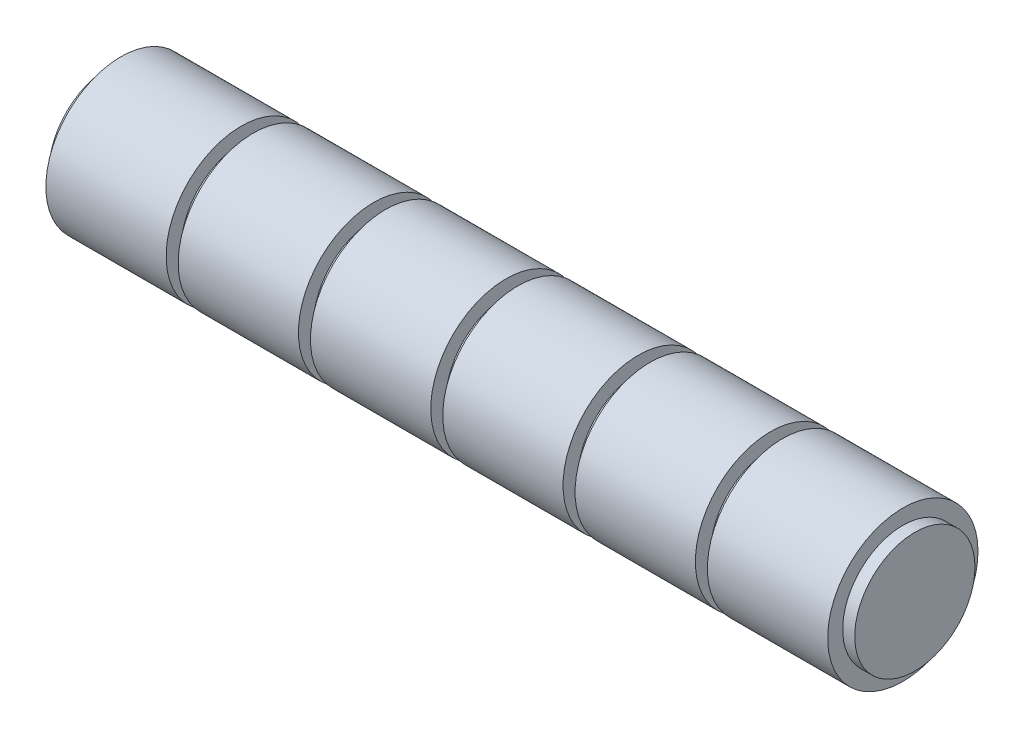
ISO-10303-21;
HEADER;
FILE_DESCRIPTION(('STEP AP214'),'2;1');
FILE_NAME('part.step','',(''),(''),'','','');
FILE_SCHEMA(('AUTOMOTIVE_DESIGN { 1 0 10303 214 1 1 1 1 }'));
ENDSEC;
DATA;
#1=APPLICATION_CONTEXT('core data for automotive mechanical design processes');
#2=APPLICATION_PROTOCOL_DEFINITION('international standard','automotive_design',2000,#1);
#3=PRODUCT_CONTEXT('',#1,'mechanical');
#4=PRODUCT('Part','Part','',(#3));
#5=PRODUCT_RELATED_PRODUCT_CATEGORY('part','',(#4));
#6=PRODUCT_DEFINITION_FORMATION('','',#4);
#7=PRODUCT_DEFINITION_CONTEXT('part definition',#1,'design');
#8=PRODUCT_DEFINITION('design','',#6,#7);
#9=PRODUCT_DEFINITION_SHAPE('','',#8);
#10=(LENGTH_UNIT() NAMED_UNIT(*) SI_UNIT(.MILLI.,.METRE.));
#11=(NAMED_UNIT(*) PLANE_ANGLE_UNIT() SI_UNIT($,.RADIAN.));
#12=(NAMED_UNIT(*) SI_UNIT($,.STERADIAN.) SOLID_ANGLE_UNIT());
#13=UNCERTAINTY_MEASURE_WITH_UNIT(LENGTH_MEASURE(1.E-05),#10,'distance_accuracy_value','');
#14=(GEOMETRIC_REPRESENTATION_CONTEXT(3) GLOBAL_UNCERTAINTY_ASSIGNED_CONTEXT((#13)) GLOBAL_UNIT_ASSIGNED_CONTEXT((#10,
#11,#12)) REPRESENTATION_CONTEXT('',''));
#15=CARTESIAN_POINT('',(0.,0.,0.));
#16=DIRECTION('',(0.,0.,1.));
#17=DIRECTION('',(1.,0.,0.));
#18=AXIS2_PLACEMENT_3D('',#15,#16,#17);
#19=CARTESIAN_POINT('',(20.,0.,0.));
#20=DIRECTION('',(-1.,0.,0.));
#21=DIRECTION('',(0.,0.,1.));
#22=AXIS2_PLACEMENT_3D('',#19,#20,#21);
#23=CYLINDRICAL_SURFACE('',#22,12.5);
#24=CARTESIAN_POINT('',(20.,0.,0.));
#25=DIRECTION('',(1.,0.,0.));
#26=DIRECTION('',(0.,0.,-1.));
#27=AXIS2_PLACEMENT_3D('',#24,#25,#26);
#28=CIRCLE('',#27,12.5);
#29=CARTESIAN_POINT('',(20.,0.,-12.5));
#30=VERTEX_POINT('',#29);
#31=EDGE_CURVE('E59',#30,#30,#28,.T.);
#32=ORIENTED_EDGE('',*,*,#31,.F.);
#33=EDGE_LOOP('',(#32));
#34=FACE_BOUND('',#33,.T.);
#35=CARTESIAN_POINT('',(0.,0.,0.));
#36=DIRECTION('',(1.,0.,0.));
#37=DIRECTION('',(0.,0.,-1.));
#38=AXIS2_PLACEMENT_3D('',#35,#36,#37);
#39=CIRCLE('',#38,12.5);
#40=CARTESIAN_POINT('',(0.,0.,-12.5));
#41=VERTEX_POINT('',#40);
#42=EDGE_CURVE('E48',#41,#41,#39,.T.);
#43=ORIENTED_EDGE('',*,*,#42,.T.);
#44=EDGE_LOOP('',(#43));
#45=FACE_BOUND('',#44,.T.);
#46=ADVANCED_FACE('F45',(#34,#45),#23,.T.);
#47=CARTESIAN_POINT('',(20.,0.,0.));
#48=DIRECTION('',(1.,0.,0.));
#49=DIRECTION('',(0.,0.,-1.));
#50=AXIS2_PLACEMENT_3D('',#47,#48,#49);
#51=PLANE('',#50);
#52=CARTESIAN_POINT('',(20.,0.,0.));
#53=DIRECTION('',(1.,0.,0.));
#54=DIRECTION('',(0.,0.,-1.));
#55=AXIS2_PLACEMENT_3D('',#52,#53,#54);
#56=CIRCLE('',#55,10.);
#57=CARTESIAN_POINT('',(20.,0.,-10.));
#58=VERTEX_POINT('',#57);
#59=EDGE_CURVE('E53',#58,#58,#56,.T.);
#60=ORIENTED_EDGE('',*,*,#59,.F.);
#61=EDGE_LOOP('',(#60));
#62=FACE_BOUND('',#61,.T.);
#63=ORIENTED_EDGE('',*,*,#31,.T.);
#64=EDGE_LOOP('',(#63));
#65=FACE_BOUND('',#64,.T.);
#66=ADVANCED_FACE('F97',(#62,#65),#51,.T.);
#67=CARTESIAN_POINT('',(0.,0.,0.));
#68=DIRECTION('',(1.,0.,0.));
#69=DIRECTION('',(0.,0.,-1.));
#70=AXIS2_PLACEMENT_3D('',#67,#68,#69);
#71=PLANE('',#70);
#72=CARTESIAN_POINT('',(0.,0.,0.));
#73=DIRECTION('',(1.,0.,0.));
#74=DIRECTION('',(0.,0.,-1.));
#75=AXIS2_PLACEMENT_3D('',#72,#73,#74);
#76=CIRCLE('',#75,10.);
#77=CARTESIAN_POINT('',(0.,0.,-10.));
#78=VERTEX_POINT('',#77);
#79=EDGE_CURVE('E65',#78,#78,#76,.T.);
#80=ORIENTED_EDGE('',*,*,#79,.T.);
#81=EDGE_LOOP('',(#80));
#82=FACE_BOUND('',#81,.T.);
#83=ORIENTED_EDGE('',*,*,#42,.F.);
#84=EDGE_LOOP('',(#83));
#85=FACE_BOUND('',#84,.T.);
#86=ADVANCED_FACE('F94',(#82,#85),#71,.F.);
#87=CARTESIAN_POINT('',(22.,0.,0.));
#88=DIRECTION('',(-1.,0.,0.));
#89=DIRECTION('',(0.,0.,1.));
#90=AXIS2_PLACEMENT_3D('',#87,#88,#89);
#91=CYLINDRICAL_SURFACE('',#90,10.);
#92=CARTESIAN_POINT('',(22.,0.,0.));
#93=DIRECTION('',(1.,0.,0.));
#94=DIRECTION('',(0.,0.,-1.));
#95=AXIS2_PLACEMENT_3D('',#92,#93,#94);
#96=CIRCLE('',#95,10.);
#97=CARTESIAN_POINT('',(22.,0.,-10.));
#98=VERTEX_POINT('',#97);
#99=EDGE_CURVE('E79',#98,#98,#96,.T.);
#100=ORIENTED_EDGE('',*,*,#99,.F.);
#101=EDGE_LOOP('',(#100));
#102=FACE_BOUND('',#101,.T.);
#103=ORIENTED_EDGE('',*,*,#59,.T.);
#104=EDGE_LOOP('',(#103));
#105=FACE_BOUND('',#104,.T.);
#106=ADVANCED_FACE('F96',(#102,#105),#91,.T.);
#107=CARTESIAN_POINT('',(42.,0.,0.));
#108=DIRECTION('',(-1.,0.,0.));
#109=DIRECTION('',(0.,0.,1.));
#110=AXIS2_PLACEMENT_3D('',#107,#108,#109);
#111=CYLINDRICAL_SURFACE('',#110,12.5);
#112=CARTESIAN_POINT('',(42.,0.,0.));
#113=DIRECTION('',(1.,0.,0.));
#114=DIRECTION('',(0.,0.,-1.));
#115=AXIS2_PLACEMENT_3D('',#112,#113,#114);
#116=CIRCLE('',#115,12.5);
#117=CARTESIAN_POINT('',(42.,0.,-12.5));
#118=VERTEX_POINT('',#117);
#119=EDGE_CURVE('E75',#118,#118,#116,.T.);
#120=ORIENTED_EDGE('',*,*,#119,.F.);
#121=EDGE_LOOP('',(#120));
#122=FACE_BOUND('',#121,.T.);
#123=CARTESIAN_POINT('',(22.,0.,0.));
#124=DIRECTION('',(1.,0.,0.));
#125=DIRECTION('',(0.,0.,-1.));
#126=AXIS2_PLACEMENT_3D('',#123,#124,#125);
#127=CIRCLE('',#126,12.5);
#128=CARTESIAN_POINT('',(22.,0.,-12.5));
#129=VERTEX_POINT('',#128);
#130=EDGE_CURVE('E69',#129,#129,#127,.T.);
#131=ORIENTED_EDGE('',*,*,#130,.T.);
#132=EDGE_LOOP('',(#131));
#133=FACE_BOUND('',#132,.T.);
#134=ADVANCED_FACE('F103',(#122,#133),#111,.T.);
#135=CARTESIAN_POINT('',(42.,0.,0.));
#136=DIRECTION('',(1.,0.,0.));
#137=DIRECTION('',(0.,0.,-1.));
#138=AXIS2_PLACEMENT_3D('',#135,#136,#137);
#139=PLANE('',#138);
#140=CARTESIAN_POINT('',(42.,0.,0.));
#141=DIRECTION('',(1.,0.,0.));
#142=DIRECTION('',(0.,0.,-1.));
#143=AXIS2_PLACEMENT_3D('',#140,#141,#142);
#144=CIRCLE('',#143,10.);
#145=CARTESIAN_POINT('',(42.,0.,-10.));
#146=VERTEX_POINT('',#145);
#147=EDGE_CURVE('E10',#146,#146,#144,.T.);
#148=ORIENTED_EDGE('',*,*,#147,.F.);
#149=EDGE_LOOP('',(#148));
#150=FACE_BOUND('',#149,.T.);
#151=ORIENTED_EDGE('',*,*,#119,.T.);
#152=EDGE_LOOP('',(#151));
#153=FACE_BOUND('',#152,.T.);
#154=ADVANCED_FACE('F136',(#150,#153),#139,.T.);
#155=CARTESIAN_POINT('',(22.,0.,0.));
#156=DIRECTION('',(1.,0.,0.));
#157=DIRECTION('',(0.,0.,-1.));
#158=AXIS2_PLACEMENT_3D('',#155,#156,#157);
#159=PLANE('',#158);
#160=ORIENTED_EDGE('',*,*,#99,.T.);
#161=EDGE_LOOP('',(#160));
#162=FACE_BOUND('',#161,.T.);
#163=ORIENTED_EDGE('',*,*,#130,.F.);
#164=EDGE_LOOP('',(#163));
#165=FACE_BOUND('',#164,.T.);
#166=ADVANCED_FACE('F145',(#162,#165),#159,.F.);
#167=CARTESIAN_POINT('',(0.,0.,0.));
#168=DIRECTION('',(-1.,0.,0.));
#169=DIRECTION('',(0.,0.,1.));
#170=AXIS2_PLACEMENT_3D('',#167,#168,#169);
#171=CYLINDRICAL_SURFACE('',#170,10.);
#172=ORIENTED_EDGE('',*,*,#79,.F.);
#173=EDGE_LOOP('',(#172));
#174=FACE_BOUND('',#173,.T.);
#175=CARTESIAN_POINT('',(-2.,0.,0.));
#176=DIRECTION('',(1.,0.,0.));
#177=DIRECTION('',(0.,0.,-1.));
#178=AXIS2_PLACEMENT_3D('',#175,#176,#177);
#179=CIRCLE('',#178,10.);
#180=CARTESIAN_POINT('',(-2.,0.,-10.));
#181=VERTEX_POINT('',#180);
#182=EDGE_CURVE('E70',#181,#181,#179,.T.);
#183=ORIENTED_EDGE('',*,*,#182,.T.);
#184=EDGE_LOOP('',(#183));
#185=FACE_BOUND('',#184,.T.);
#186=ADVANCED_FACE('F155',(#174,#185),#171,.T.);
#187=CARTESIAN_POINT('',(44.,0.,0.));
#188=DIRECTION('',(-1.,0.,0.));
#189=DIRECTION('',(0.,0.,1.));
#190=AXIS2_PLACEMENT_3D('',#187,#188,#189);
#191=CYLINDRICAL_SURFACE('',#190,10.);
#192=CARTESIAN_POINT('',(44.,0.,0.));
#193=DIRECTION('',(1.,0.,0.));
#194=DIRECTION('',(0.,0.,-1.));
#195=AXIS2_PLACEMENT_3D('',#192,#193,#194);
#196=CIRCLE('',#195,10.);
#197=CARTESIAN_POINT('',(44.,0.,-10.));
#198=VERTEX_POINT('',#197);
#199=EDGE_CURVE('E63',#198,#198,#196,.T.);
#200=ORIENTED_EDGE('',*,*,#199,.F.);
#201=EDGE_LOOP('',(#200));
#202=FACE_BOUND('',#201,.T.);
#203=ORIENTED_EDGE('',*,*,#147,.T.);
#204=EDGE_LOOP('',(#203));
#205=FACE_BOUND('',#204,.T.);
#206=ADVANCED_FACE('F166',(#202,#205),#191,.T.);
#207=CARTESIAN_POINT('',(44.,0.,0.));
#208=DIRECTION('',(1.,0.,0.));
#209=DIRECTION('',(0.,0.,-1.));
#210=AXIS2_PLACEMENT_3D('',#207,#208,#209);
#211=PLANE('',#210);
#212=ORIENTED_EDGE('',*,*,#199,.T.);
#213=EDGE_LOOP('',(#212));
#214=FACE_BOUND('',#213,.T.);
#215=ADVANCED_FACE('F176',(#214),#211,.T.);
#216=CARTESIAN_POINT('',(-2.,0.,0.));
#217=DIRECTION('',(-1.,0.,0.));
#218=DIRECTION('',(0.,0.,1.));
#219=AXIS2_PLACEMENT_3D('',#216,#217,#218);
#220=CYLINDRICAL_SURFACE('',#219,12.5);
#221=CARTESIAN_POINT('',(-2.,0.,0.));
#222=DIRECTION('',(1.,0.,0.));
#223=DIRECTION('',(0.,0.,-1.));
#224=AXIS2_PLACEMENT_3D('',#221,#222,#223);
#225=CIRCLE('',#224,12.5);
#226=CARTESIAN_POINT('',(-2.,0.,-12.5));
#227=VERTEX_POINT('',#226);
#228=EDGE_CURVE('E74',#227,#227,#225,.T.);
#229=ORIENTED_EDGE('',*,*,#228,.F.);
#230=EDGE_LOOP('',(#229));
#231=FACE_BOUND('',#230,.T.);
#232=CARTESIAN_POINT('',(-22.,0.,0.));
#233=DIRECTION('',(1.,0.,0.));
#234=DIRECTION('',(0.,0.,-1.));
#235=AXIS2_PLACEMENT_3D('',#232,#233,#234);
#236=CIRCLE('',#235,12.5);
#237=CARTESIAN_POINT('',(-22.,0.,-12.5));
#238=VERTEX_POINT('',#237);
#239=EDGE_CURVE('E555',#238,#238,#236,.T.);
#240=ORIENTED_EDGE('',*,*,#239,.T.);
#241=EDGE_LOOP('',(#240));
#242=FACE_BOUND('',#241,.T.);
#243=ADVANCED_FACE('F186',(#231,#242),#220,.T.);
#244=CARTESIAN_POINT('',(-2.,0.,0.));
#245=DIRECTION('',(1.,0.,0.));
#246=DIRECTION('',(0.,0.,-1.));
#247=AXIS2_PLACEMENT_3D('',#244,#245,#246);
#248=PLANE('',#247);
#249=ORIENTED_EDGE('',*,*,#182,.F.);
#250=EDGE_LOOP('',(#249));
#251=FACE_BOUND('',#250,.T.);
#252=ORIENTED_EDGE('',*,*,#228,.T.);
#253=EDGE_LOOP('',(#252));
#254=FACE_BOUND('',#253,.T.);
#255=ADVANCED_FACE('F197',(#251,#254),#248,.T.);
#256=CARTESIAN_POINT('',(-22.,0.,0.));
#257=DIRECTION('',(1.,0.,0.));
#258=DIRECTION('',(0.,0.,-1.));
#259=AXIS2_PLACEMENT_3D('',#256,#257,#258);
#260=PLANE('',#259);
#261=CARTESIAN_POINT('',(-22.,0.,0.));
#262=DIRECTION('',(1.,0.,0.));
#263=DIRECTION('',(0.,0.,-1.));
#264=AXIS2_PLACEMENT_3D('',#261,#262,#263);
#265=CIRCLE('',#264,10.);
#266=CARTESIAN_POINT('',(-22.,0.,-10.));
#267=VERTEX_POINT('',#266);
#268=EDGE_CURVE('E551',#267,#267,#265,.T.);
#269=ORIENTED_EDGE('',*,*,#268,.T.);
#270=EDGE_LOOP('',(#269));
#271=FACE_BOUND('',#270,.T.);
#272=ORIENTED_EDGE('',*,*,#239,.F.);
#273=EDGE_LOOP('',(#272));
#274=FACE_BOUND('',#273,.T.);
#275=ADVANCED_FACE('F208',(#271,#274),#260,.F.);
#276=CARTESIAN_POINT('',(-22.,0.,0.));
#277=DIRECTION('',(-1.,0.,0.));
#278=DIRECTION('',(0.,0.,1.));
#279=AXIS2_PLACEMENT_3D('',#276,#277,#278);
#280=CYLINDRICAL_SURFACE('',#279,10.);
#281=ORIENTED_EDGE('',*,*,#268,.F.);
#282=EDGE_LOOP('',(#281));
#283=FACE_BOUND('',#282,.T.);
#284=CARTESIAN_POINT('',(-24.,0.,0.));
#285=DIRECTION('',(1.,0.,0.));
#286=DIRECTION('',(0.,0.,-1.));
#287=AXIS2_PLACEMENT_3D('',#284,#285,#286);
#288=CIRCLE('',#287,10.);
#289=CARTESIAN_POINT('',(-24.,0.,-10.));
#290=VERTEX_POINT('',#289);
#291=EDGE_CURVE('E547',#290,#290,#288,.T.);
#292=ORIENTED_EDGE('',*,*,#291,.T.);
#293=EDGE_LOOP('',(#292));
#294=FACE_BOUND('',#293,.T.);
#295=ADVANCED_FACE('F219',(#283,#294),#280,.T.);
#296=CARTESIAN_POINT('',(-24.,0.,0.));
#297=DIRECTION('',(-1.,0.,0.));
#298=DIRECTION('',(0.,0.,1.));
#299=AXIS2_PLACEMENT_3D('',#296,#297,#298);
#300=CYLINDRICAL_SURFACE('',#299,12.5);
#301=CARTESIAN_POINT('',(-24.,0.,0.));
#302=DIRECTION('',(1.,0.,0.));
#303=DIRECTION('',(0.,0.,-1.));
#304=AXIS2_PLACEMENT_3D('',#301,#302,#303);
#305=CIRCLE('',#304,12.5);
#306=CARTESIAN_POINT('',(-24.,0.,-12.5));
#307=VERTEX_POINT('',#306);
#308=EDGE_CURVE('E543',#307,#307,#305,.T.);
#309=ORIENTED_EDGE('',*,*,#308,.F.);
#310=EDGE_LOOP('',(#309));
#311=FACE_BOUND('',#310,.T.);
#312=CARTESIAN_POINT('',(-44.,0.,0.));
#313=DIRECTION('',(1.,0.,0.));
#314=DIRECTION('',(0.,0.,-1.));
#315=AXIS2_PLACEMENT_3D('',#312,#313,#314);
#316=CIRCLE('',#315,12.5);
#317=CARTESIAN_POINT('',(-44.,0.,-12.5));
#318=VERTEX_POINT('',#317);
#319=EDGE_CURVE('E539',#318,#318,#316,.T.);
#320=ORIENTED_EDGE('',*,*,#319,.T.);
#321=EDGE_LOOP('',(#320));
#322=FACE_BOUND('',#321,.T.);
#323=ADVANCED_FACE('F230',(#311,#322),#300,.T.);
#324=CARTESIAN_POINT('',(-24.,0.,0.));
#325=DIRECTION('',(1.,0.,0.));
#326=DIRECTION('',(0.,0.,-1.));
#327=AXIS2_PLACEMENT_3D('',#324,#325,#326);
#328=PLANE('',#327);
#329=ORIENTED_EDGE('',*,*,#291,.F.);
#330=EDGE_LOOP('',(#329));
#331=FACE_BOUND('',#330,.T.);
#332=ORIENTED_EDGE('',*,*,#308,.T.);
#333=EDGE_LOOP('',(#332));
#334=FACE_BOUND('',#333,.T.);
#335=ADVANCED_FACE('F241',(#331,#334),#328,.T.);
#336=CARTESIAN_POINT('',(-44.,0.,0.));
#337=DIRECTION('',(1.,0.,0.));
#338=DIRECTION('',(0.,0.,-1.));
#339=AXIS2_PLACEMENT_3D('',#336,#337,#338);
#340=PLANE('',#339);
#341=CARTESIAN_POINT('',(-44.,0.,0.));
#342=DIRECTION('',(1.,0.,0.));
#343=DIRECTION('',(0.,0.,-1.));
#344=AXIS2_PLACEMENT_3D('',#341,#342,#343);
#345=CIRCLE('',#344,10.);
#346=CARTESIAN_POINT('',(-44.,0.,-10.));
#347=VERTEX_POINT('',#346);
#348=EDGE_CURVE('E535',#347,#347,#345,.T.);
#349=ORIENTED_EDGE('',*,*,#348,.T.);
#350=EDGE_LOOP('',(#349));
#351=FACE_BOUND('',#350,.T.);
#352=ORIENTED_EDGE('',*,*,#319,.F.);
#353=EDGE_LOOP('',(#352));
#354=FACE_BOUND('',#353,.T.);
#355=ADVANCED_FACE('F252',(#351,#354),#340,.F.);
#356=CARTESIAN_POINT('',(-44.,0.,0.));
#357=DIRECTION('',(-1.,0.,0.));
#358=DIRECTION('',(0.,0.,1.));
#359=AXIS2_PLACEMENT_3D('',#356,#357,#358);
#360=CYLINDRICAL_SURFACE('',#359,10.);
#361=ORIENTED_EDGE('',*,*,#348,.F.);
#362=EDGE_LOOP('',(#361));
#363=FACE_BOUND('',#362,.T.);
#364=CARTESIAN_POINT('',(-46.,0.,0.));
#365=DIRECTION('',(1.,0.,0.));
#366=DIRECTION('',(0.,0.,-1.));
#367=AXIS2_PLACEMENT_3D('',#364,#365,#366);
#368=CIRCLE('',#367,10.);
#369=CARTESIAN_POINT('',(-46.,0.,-10.));
#370=VERTEX_POINT('',#369);
#371=EDGE_CURVE('E531',#370,#370,#368,.T.);
#372=ORIENTED_EDGE('',*,*,#371,.T.);
#373=EDGE_LOOP('',(#372));
#374=FACE_BOUND('',#373,.T.);
#375=ADVANCED_FACE('F262',(#363,#374),#360,.T.);
#376=CARTESIAN_POINT('',(-46.,0.,0.));
#377=DIRECTION('',(-1.,0.,0.));
#378=DIRECTION('',(0.,0.,1.));
#379=AXIS2_PLACEMENT_3D('',#376,#377,#378);
#380=CYLINDRICAL_SURFACE('',#379,12.5);
#381=CARTESIAN_POINT('',(-46.,0.,0.));
#382=DIRECTION('',(1.,0.,0.));
#383=DIRECTION('',(0.,0.,-1.));
#384=AXIS2_PLACEMENT_3D('',#381,#382,#383);
#385=CIRCLE('',#384,12.5);
#386=CARTESIAN_POINT('',(-46.,0.,-12.5));
#387=VERTEX_POINT('',#386);
#388=EDGE_CURVE('E527',#387,#387,#385,.T.);
#389=ORIENTED_EDGE('',*,*,#388,.F.);
#390=EDGE_LOOP('',(#389));
#391=FACE_BOUND('',#390,.T.);
#392=CARTESIAN_POINT('',(-66.,0.,0.));
#393=DIRECTION('',(1.,0.,0.));
#394=DIRECTION('',(0.,0.,-1.));
#395=AXIS2_PLACEMENT_3D('',#392,#393,#394);
#396=CIRCLE('',#395,12.5);
#397=CARTESIAN_POINT('',(-66.,0.,-12.5));
#398=VERTEX_POINT('',#397);
#399=EDGE_CURVE('E523',#398,#398,#396,.T.);
#400=ORIENTED_EDGE('',*,*,#399,.T.);
#401=EDGE_LOOP('',(#400));
#402=FACE_BOUND('',#401,.T.);
#403=ADVANCED_FACE('F271',(#391,#402),#380,.T.);
#404=CARTESIAN_POINT('',(-46.,0.,0.));
#405=DIRECTION('',(1.,0.,0.));
#406=DIRECTION('',(0.,0.,-1.));
#407=AXIS2_PLACEMENT_3D('',#404,#405,#406);
#408=PLANE('',#407);
#409=ORIENTED_EDGE('',*,*,#371,.F.);
#410=EDGE_LOOP('',(#409));
#411=FACE_BOUND('',#410,.T.);
#412=ORIENTED_EDGE('',*,*,#388,.T.);
#413=EDGE_LOOP('',(#412));
#414=FACE_BOUND('',#413,.T.);
#415=ADVANCED_FACE('F280',(#411,#414),#408,.T.);
#416=CARTESIAN_POINT('',(-66.,0.,0.));
#417=DIRECTION('',(1.,0.,0.));
#418=DIRECTION('',(0.,0.,-1.));
#419=AXIS2_PLACEMENT_3D('',#416,#417,#418);
#420=PLANE('',#419);
#421=CARTESIAN_POINT('',(-66.,0.,0.));
#422=DIRECTION('',(1.,0.,0.));
#423=DIRECTION('',(0.,0.,-1.));
#424=AXIS2_PLACEMENT_3D('',#421,#422,#423);
#425=CIRCLE('',#424,10.);
#426=CARTESIAN_POINT('',(-66.,0.,-10.));
#427=VERTEX_POINT('',#426);
#428=EDGE_CURVE('E519',#427,#427,#425,.T.);
#429=ORIENTED_EDGE('',*,*,#428,.T.);
#430=EDGE_LOOP('',(#429));
#431=FACE_BOUND('',#430,.T.);
#432=ORIENTED_EDGE('',*,*,#399,.F.);
#433=EDGE_LOOP('',(#432));
#434=FACE_BOUND('',#433,.T.);
#435=ADVANCED_FACE('F290',(#431,#434),#420,.F.);
#436=CARTESIAN_POINT('',(-66.,0.,0.));
#437=DIRECTION('',(-1.,0.,0.));
#438=DIRECTION('',(0.,0.,1.));
#439=AXIS2_PLACEMENT_3D('',#436,#437,#438);
#440=CYLINDRICAL_SURFACE('',#439,10.);
#441=ORIENTED_EDGE('',*,*,#428,.F.);
#442=EDGE_LOOP('',(#441));
#443=FACE_BOUND('',#442,.T.);
#444=CARTESIAN_POINT('',(-68.,0.,0.));
#445=DIRECTION('',(1.,0.,0.));
#446=DIRECTION('',(0.,0.,-1.));
#447=AXIS2_PLACEMENT_3D('',#444,#445,#446);
#448=CIRCLE('',#447,10.);
#449=CARTESIAN_POINT('',(-68.,0.,-10.));
#450=VERTEX_POINT('',#449);
#451=EDGE_CURVE('E515',#450,#450,#448,.T.);
#452=ORIENTED_EDGE('',*,*,#451,.T.);
#453=EDGE_LOOP('',(#452));
#454=FACE_BOUND('',#453,.T.);
#455=ADVANCED_FACE('F300',(#443,#454),#440,.T.);
#456=CARTESIAN_POINT('',(-68.,0.,0.));
#457=DIRECTION('',(-1.,0.,0.));
#458=DIRECTION('',(0.,0.,1.));
#459=AXIS2_PLACEMENT_3D('',#456,#457,#458);
#460=CYLINDRICAL_SURFACE('',#459,12.5);
#461=CARTESIAN_POINT('',(-68.,0.,0.));
#462=DIRECTION('',(1.,0.,0.));
#463=DIRECTION('',(0.,0.,-1.));
#464=AXIS2_PLACEMENT_3D('',#461,#462,#463);
#465=CIRCLE('',#464,12.5);
#466=CARTESIAN_POINT('',(-68.,0.,-12.5));
#467=VERTEX_POINT('',#466);
#468=EDGE_CURVE('E511',#467,#467,#465,.T.);
#469=ORIENTED_EDGE('',*,*,#468,.F.);
#470=EDGE_LOOP('',(#469));
#471=FACE_BOUND('',#470,.T.);
#472=CARTESIAN_POINT('',(-88.,0.,0.));
#473=DIRECTION('',(1.,0.,0.));
#474=DIRECTION('',(0.,0.,-1.));
#475=AXIS2_PLACEMENT_3D('',#472,#473,#474);
#476=CIRCLE('',#475,12.5);
#477=CARTESIAN_POINT('',(-88.,0.,-12.5));
#478=VERTEX_POINT('',#477);
#479=EDGE_CURVE('E508',#478,#478,#476,.T.);
#480=ORIENTED_EDGE('',*,*,#479,.T.);
#481=EDGE_LOOP('',(#480));
#482=FACE_BOUND('',#481,.T.);
#483=ADVANCED_FACE('F308',(#471,#482),#460,.T.);
#484=CARTESIAN_POINT('',(-68.,0.,0.));
#485=DIRECTION('',(1.,0.,0.));
#486=DIRECTION('',(0.,0.,-1.));
#487=AXIS2_PLACEMENT_3D('',#484,#485,#486);
#488=PLANE('',#487);
#489=ORIENTED_EDGE('',*,*,#451,.F.);
#490=EDGE_LOOP('',(#489));
#491=FACE_BOUND('',#490,.T.);
#492=ORIENTED_EDGE('',*,*,#468,.T.);
#493=EDGE_LOOP('',(#492));
#494=FACE_BOUND('',#493,.T.);
#495=ADVANCED_FACE('F317',(#491,#494),#488,.T.);
#496=CARTESIAN_POINT('',(-88.,0.,0.));
#497=DIRECTION('',(1.,0.,0.));
#498=DIRECTION('',(0.,0.,-1.));
#499=AXIS2_PLACEMENT_3D('',#496,#497,#498);
#500=PLANE('',#499);
#501=CARTESIAN_POINT('',(-88.,0.,0.));
#502=DIRECTION('',(1.,0.,0.));
#503=DIRECTION('',(0.,0.,-1.));
#504=AXIS2_PLACEMENT_3D('',#501,#502,#503);
#505=CIRCLE('',#504,10.);
#506=CARTESIAN_POINT('',(-88.,0.,-10.));
#507=VERTEX_POINT('',#506);
#508=EDGE_CURVE('E504',#507,#507,#505,.T.);
#509=ORIENTED_EDGE('',*,*,#508,.T.);
#510=EDGE_LOOP('',(#509));
#511=FACE_BOUND('',#510,.T.);
#512=ORIENTED_EDGE('',*,*,#479,.F.);
#513=EDGE_LOOP('',(#512));
#514=FACE_BOUND('',#513,.T.);
#515=ADVANCED_FACE('F327',(#511,#514),#500,.F.);
#516=CARTESIAN_POINT('',(-88.,0.,0.));
#517=DIRECTION('',(-1.,0.,0.));
#518=DIRECTION('',(0.,0.,1.));
#519=AXIS2_PLACEMENT_3D('',#516,#517,#518);
#520=CYLINDRICAL_SURFACE('',#519,10.);
#521=ORIENTED_EDGE('',*,*,#508,.F.);
#522=EDGE_LOOP('',(#521));
#523=FACE_BOUND('',#522,.T.);
#524=CARTESIAN_POINT('',(-90.,0.,0.));
#525=DIRECTION('',(1.,0.,0.));
#526=DIRECTION('',(0.,0.,-1.));
#527=AXIS2_PLACEMENT_3D('',#524,#525,#526);
#528=CIRCLE('',#527,10.);
#529=CARTESIAN_POINT('',(-90.,0.,-10.));
#530=VERTEX_POINT('',#529);
#531=EDGE_CURVE('E501',#530,#530,#528,.T.);
#532=ORIENTED_EDGE('',*,*,#531,.T.);
#533=EDGE_LOOP('',(#532));
#534=FACE_BOUND('',#533,.T.);
#535=ADVANCED_FACE('F337',(#523,#534),#520,.T.);
#536=CARTESIAN_POINT('',(-90.,0.,0.));
#537=DIRECTION('',(1.,0.,0.));
#538=DIRECTION('',(0.,0.,-1.));
#539=AXIS2_PLACEMENT_3D('',#536,#537,#538);
#540=PLANE('',#539);
#541=ORIENTED_EDGE('',*,*,#531,.F.);
#542=EDGE_LOOP('',(#541));
#543=FACE_BOUND('',#542,.T.);
#544=ADVANCED_FACE('F345',(#543),#540,.F.);
#545=CLOSED_SHELL('',(#46,#66,#86,#106,#134,#154,#166,#186,#206,#215,#243,#255,#275,#295,#323,
#335,#355,#375,#403,#415,#435,#455,#483,#495,#515,#535,#544));
#546=MANIFOLD_SOLID_BREP('B2',#545);
#547=ADVANCED_BREP_SHAPE_REPRESENTATION('',(#18,#546),#14);
#548=SHAPE_DEFINITION_REPRESENTATION(#9,#547);
ENDSEC;
END-ISO-10303-21;
